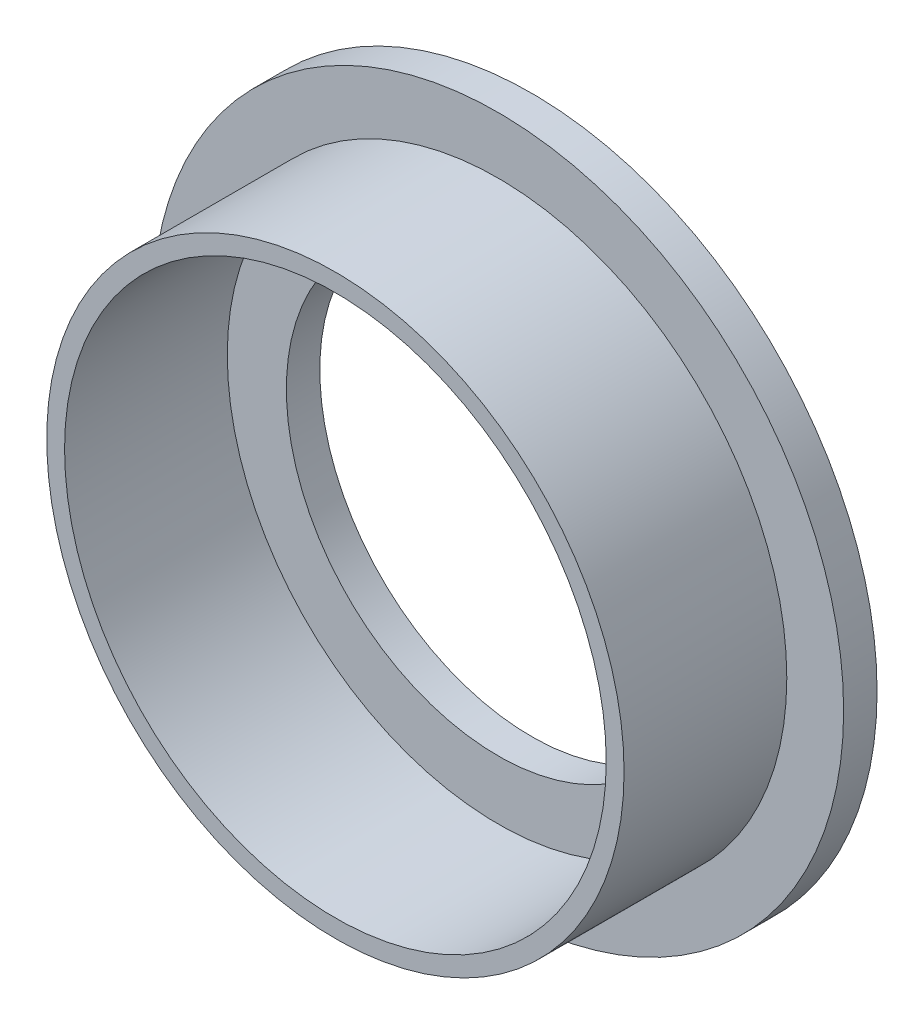
ISO-10303-21;
HEADER;
FILE_DESCRIPTION(('STEP AP214'),'2;1');
FILE_NAME('part.step','',(''),(''),'','','');
FILE_SCHEMA(('AUTOMOTIVE_DESIGN { 1 0 10303 214 1 1 1 1 }'));
ENDSEC;
DATA;
#1=APPLICATION_CONTEXT('core data for automotive mechanical design processes');
#2=APPLICATION_PROTOCOL_DEFINITION('international standard','automotive_design',2000,#1);
#3=PRODUCT_CONTEXT('',#1,'mechanical');
#4=PRODUCT('Part','Part','',(#3));
#5=PRODUCT_RELATED_PRODUCT_CATEGORY('part','',(#4));
#6=PRODUCT_DEFINITION_FORMATION('','',#4);
#7=PRODUCT_DEFINITION_CONTEXT('part definition',#1,'design');
#8=PRODUCT_DEFINITION('design','',#6,#7);
#9=PRODUCT_DEFINITION_SHAPE('','',#8);
#10=(LENGTH_UNIT() NAMED_UNIT(*) SI_UNIT(.MILLI.,.METRE.));
#11=(NAMED_UNIT(*) PLANE_ANGLE_UNIT() SI_UNIT($,.RADIAN.));
#12=(NAMED_UNIT(*) SI_UNIT($,.STERADIAN.) SOLID_ANGLE_UNIT());
#13=UNCERTAINTY_MEASURE_WITH_UNIT(LENGTH_MEASURE(1.E-05),#10,'distance_accuracy_value','');
#14=(GEOMETRIC_REPRESENTATION_CONTEXT(3) GLOBAL_UNCERTAINTY_ASSIGNED_CONTEXT((#13)) GLOBAL_UNIT_ASSIGNED_CONTEXT((#10,
#11,#12)) REPRESENTATION_CONTEXT('',''));
#15=CARTESIAN_POINT('',(0.,0.,0.));
#16=DIRECTION('',(0.,0.,1.));
#17=DIRECTION('',(1.,0.,0.));
#18=AXIS2_PLACEMENT_3D('',#15,#16,#17);
#19=CARTESIAN_POINT('',(38.,0.,1.5));
#20=DIRECTION('',(0.,0.,1.));
#21=DIRECTION('',(1.,0.,0.));
#22=AXIS2_PLACEMENT_3D('',#19,#20,#21);
#23=PLANE('',#22);
#24=CARTESIAN_POINT('',(38.,0.,1.5));
#25=DIRECTION('',(0.,0.,1.));
#26=DIRECTION('',(1.,0.,0.));
#27=AXIS2_PLACEMENT_3D('',#24,#25,#26);
#28=CIRCLE('',#27,15.5);
#29=CARTESIAN_POINT('',(53.5,0.,1.5));
#30=VERTEX_POINT('',#29);
#31=EDGE_CURVE('E38',#30,#30,#28,.T.);
#32=ORIENTED_EDGE('',*,*,#31,.T.);
#33=EDGE_LOOP('',(#32));
#34=FACE_BOUND('',#33,.T.);
#35=CARTESIAN_POINT('',(38.,0.,1.5));
#36=DIRECTION('',(0.,0.,1.));
#37=DIRECTION('',(1.,0.,0.));
#38=AXIS2_PLACEMENT_3D('',#35,#36,#37);
#39=CIRCLE('',#38,12.95);
#40=CARTESIAN_POINT('',(50.95,0.,1.5));
#41=VERTEX_POINT('',#40);
#42=EDGE_CURVE('E55',#41,#41,#39,.T.);
#43=ORIENTED_EDGE('',*,*,#42,.F.);
#44=EDGE_LOOP('',(#43));
#45=FACE_BOUND('',#44,.T.);
#46=ADVANCED_FACE('F31',(#34,#45),#23,.T.);
#47=CARTESIAN_POINT('',(38.,0.,1.5));
#48=DIRECTION('',(0.,0.,1.));
#49=DIRECTION('',(1.,0.,0.));
#50=AXIS2_PLACEMENT_3D('',#47,#48,#49);
#51=CIRCLE('',#50,12.15);
#52=CARTESIAN_POINT('',(50.15,0.,1.5));
#53=VERTEX_POINT('',#52);
#54=EDGE_CURVE('E10',#53,#53,#51,.F.);
#55=ORIENTED_EDGE('',*,*,#54,.F.);
#56=EDGE_LOOP('',(#55));
#57=FACE_BOUND('',#56,.T.);
#58=CARTESIAN_POINT('',(38.,0.,1.5));
#59=DIRECTION('',(0.,0.,1.));
#60=DIRECTION('',(1.,0.,0.));
#61=AXIS2_PLACEMENT_3D('',#58,#59,#60);
#62=CIRCLE('',#61,9.5);
#63=CARTESIAN_POINT('',(47.5,0.,1.5));
#64=VERTEX_POINT('',#63);
#65=EDGE_CURVE('E47',#64,#64,#62,.T.);
#66=ORIENTED_EDGE('',*,*,#65,.F.);
#67=EDGE_LOOP('',(#66));
#68=FACE_BOUND('',#67,.T.);
#69=ADVANCED_FACE('F82',(#57,#68),#23,.T.);
#70=CARTESIAN_POINT('',(38.,0.,0.));
#71=DIRECTION('',(0.,0.,1.));
#72=DIRECTION('',(1.,0.,0.));
#73=AXIS2_PLACEMENT_3D('',#70,#71,#72);
#74=PLANE('',#73);
#75=CARTESIAN_POINT('',(38.,0.,0.));
#76=DIRECTION('',(0.,0.,1.));
#77=DIRECTION('',(1.,0.,0.));
#78=AXIS2_PLACEMENT_3D('',#75,#76,#77);
#79=CIRCLE('',#78,15.5);
#80=CARTESIAN_POINT('',(53.5,0.,0.));
#81=VERTEX_POINT('',#80);
#82=EDGE_CURVE('E42',#81,#81,#79,.T.);
#83=ORIENTED_EDGE('',*,*,#82,.F.);
#84=EDGE_LOOP('',(#83));
#85=FACE_BOUND('',#84,.T.);
#86=CARTESIAN_POINT('',(38.,0.,0.));
#87=DIRECTION('',(0.,0.,1.));
#88=DIRECTION('',(1.,0.,0.));
#89=AXIS2_PLACEMENT_3D('',#86,#87,#88);
#90=CIRCLE('',#89,9.5);
#91=CARTESIAN_POINT('',(47.5,0.,0.));
#92=VERTEX_POINT('',#91);
#93=EDGE_CURVE('E49',#92,#92,#90,.T.);
#94=ORIENTED_EDGE('',*,*,#93,.T.);
#95=EDGE_LOOP('',(#94));
#96=FACE_BOUND('',#95,.T.);
#97=ADVANCED_FACE('F87',(#85,#96),#74,.F.);
#98=CARTESIAN_POINT('',(38.,0.,1.5));
#99=DIRECTION('',(0.,0.,-1.));
#100=DIRECTION('',(-1.,0.,0.));
#101=AXIS2_PLACEMENT_3D('',#98,#99,#100);
#102=CYLINDRICAL_SURFACE('',#101,15.5);
#103=ORIENTED_EDGE('',*,*,#31,.F.);
#104=EDGE_LOOP('',(#103));
#105=FACE_BOUND('',#104,.T.);
#106=ORIENTED_EDGE('',*,*,#82,.T.);
#107=EDGE_LOOP('',(#106));
#108=FACE_BOUND('',#107,.T.);
#109=ADVANCED_FACE('F33',(#105,#108),#102,.T.);
#110=CARTESIAN_POINT('',(38.,0.,1.5));
#111=DIRECTION('',(0.,0.,-1.));
#112=DIRECTION('',(-1.,0.,0.));
#113=AXIS2_PLACEMENT_3D('',#110,#111,#112);
#114=CYLINDRICAL_SURFACE('',#113,9.5);
#115=ORIENTED_EDGE('',*,*,#65,.T.);
#116=EDGE_LOOP('',(#115));
#117=FACE_BOUND('',#116,.T.);
#118=ORIENTED_EDGE('',*,*,#93,.F.);
#119=EDGE_LOOP('',(#118));
#120=FACE_BOUND('',#119,.T.);
#121=ADVANCED_FACE('F69',(#117,#120),#114,.F.);
#122=CARTESIAN_POINT('',(38.,0.,8.8));
#123=DIRECTION('',(0.,0.,1.));
#124=DIRECTION('',(1.,0.,0.));
#125=AXIS2_PLACEMENT_3D('',#122,#123,#124);
#126=PLANE('',#125);
#127=CARTESIAN_POINT('',(38.,0.,8.8));
#128=DIRECTION('',(0.,0.,1.));
#129=DIRECTION('',(1.,0.,0.));
#130=AXIS2_PLACEMENT_3D('',#127,#128,#129);
#131=CIRCLE('',#130,12.95);
#132=CARTESIAN_POINT('',(50.95,0.,8.8));
#133=VERTEX_POINT('',#132);
#134=EDGE_CURVE('E52',#133,#133,#131,.T.);
#135=ORIENTED_EDGE('',*,*,#134,.T.);
#136=EDGE_LOOP('',(#135));
#137=FACE_BOUND('',#136,.T.);
#138=CARTESIAN_POINT('',(38.,0.,8.8));
#139=DIRECTION('',(0.,0.,1.));
#140=DIRECTION('',(1.,0.,0.));
#141=AXIS2_PLACEMENT_3D('',#138,#139,#140);
#142=CIRCLE('',#141,12.15);
#143=CARTESIAN_POINT('',(50.15,0.,8.8));
#144=VERTEX_POINT('',#143);
#145=EDGE_CURVE('E58',#144,#144,#142,.T.);
#146=ORIENTED_EDGE('',*,*,#145,.F.);
#147=EDGE_LOOP('',(#146));
#148=FACE_BOUND('',#147,.T.);
#149=ADVANCED_FACE('F66',(#137,#148),#126,.T.);
#150=CARTESIAN_POINT('',(38.,0.,8.8));
#151=DIRECTION('',(0.,0.,-1.));
#152=DIRECTION('',(-1.,0.,0.));
#153=AXIS2_PLACEMENT_3D('',#150,#151,#152);
#154=CYLINDRICAL_SURFACE('',#153,12.95);
#155=ORIENTED_EDGE('',*,*,#134,.F.);
#156=EDGE_LOOP('',(#155));
#157=FACE_BOUND('',#156,.T.);
#158=ORIENTED_EDGE('',*,*,#42,.T.);
#159=EDGE_LOOP('',(#158));
#160=FACE_BOUND('',#159,.T.);
#161=ADVANCED_FACE('F68',(#157,#160),#154,.T.);
#162=CARTESIAN_POINT('',(38.,0.,8.8));
#163=DIRECTION('',(0.,0.,-1.));
#164=DIRECTION('',(-1.,0.,0.));
#165=AXIS2_PLACEMENT_3D('',#162,#163,#164);
#166=CYLINDRICAL_SURFACE('',#165,12.15);
#167=ORIENTED_EDGE('',*,*,#145,.T.);
#168=EDGE_LOOP('',(#167));
#169=FACE_BOUND('',#168,.T.);
#170=ORIENTED_EDGE('',*,*,#54,.T.);
#171=EDGE_LOOP('',(#170));
#172=FACE_BOUND('',#171,.T.);
#173=ADVANCED_FACE('F64',(#169,#172),#166,.F.);
#174=CLOSED_SHELL('',(#46,#69,#97,#109,#121,#149,#161,#173));
#175=MANIFOLD_SOLID_BREP('B2',#174);
#176=ADVANCED_BREP_SHAPE_REPRESENTATION('',(#18,#175),#14);
#177=SHAPE_DEFINITION_REPRESENTATION(#9,#176);
ENDSEC;
END-ISO-10303-21;
